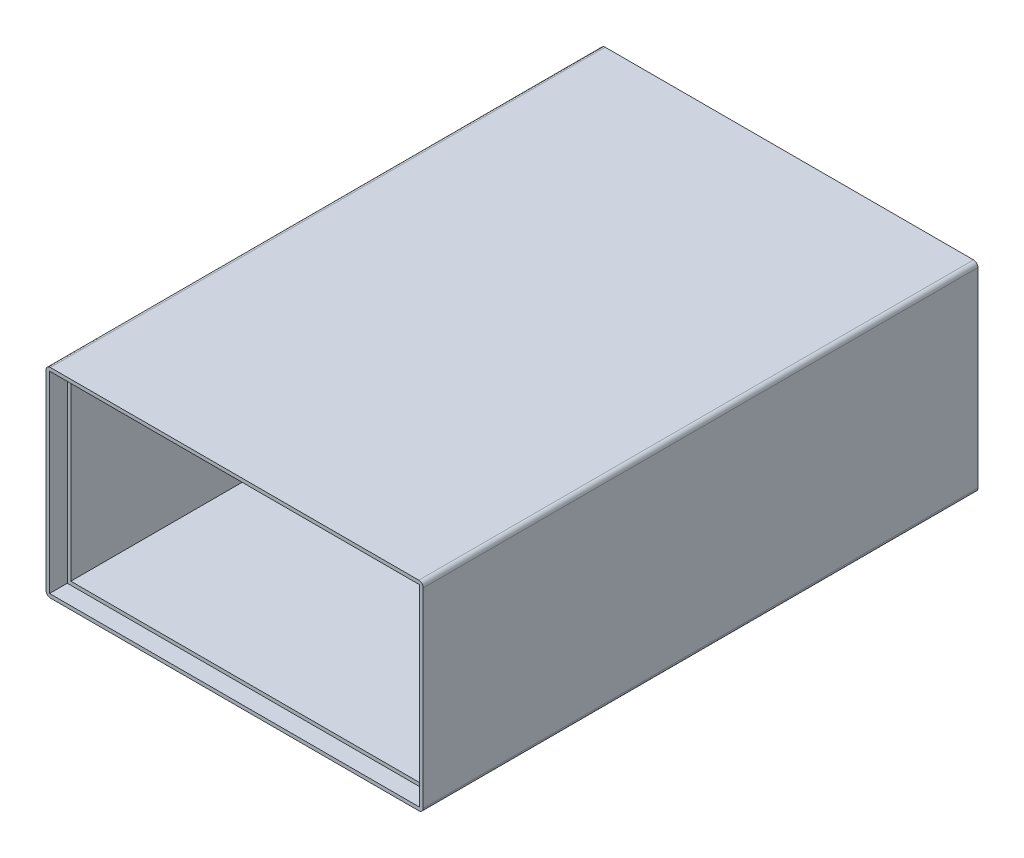
ISO-10303-21;
HEADER;
FILE_DESCRIPTION(('STEP AP214'),'2;1');
FILE_NAME('part.step','',(''),(''),'','','');
FILE_SCHEMA(('AUTOMOTIVE_DESIGN { 1 0 10303 214 1 1 1 1 }'));
ENDSEC;
DATA;
#1=APPLICATION_CONTEXT('core data for automotive mechanical design processes');
#2=APPLICATION_PROTOCOL_DEFINITION('international standard','automotive_design',2000,#1);
#3=PRODUCT_CONTEXT('',#1,'mechanical');
#4=PRODUCT('Part','Part','',(#3));
#5=PRODUCT_RELATED_PRODUCT_CATEGORY('part','',(#4));
#6=PRODUCT_DEFINITION_FORMATION('','',#4);
#7=PRODUCT_DEFINITION_CONTEXT('part definition',#1,'design');
#8=PRODUCT_DEFINITION('design','',#6,#7);
#9=PRODUCT_DEFINITION_SHAPE('','',#8);
#10=(LENGTH_UNIT() NAMED_UNIT(*) SI_UNIT(.MILLI.,.METRE.));
#11=(NAMED_UNIT(*) PLANE_ANGLE_UNIT() SI_UNIT($,.RADIAN.));
#12=(NAMED_UNIT(*) SI_UNIT($,.STERADIAN.) SOLID_ANGLE_UNIT());
#13=UNCERTAINTY_MEASURE_WITH_UNIT(LENGTH_MEASURE(1.E-05),#10,'distance_accuracy_value','');
#14=(GEOMETRIC_REPRESENTATION_CONTEXT(3) GLOBAL_UNCERTAINTY_ASSIGNED_CONTEXT((#13)) GLOBAL_UNIT_ASSIGNED_CONTEXT((#10,
#11,#12)) REPRESENTATION_CONTEXT('',''));
#15=CARTESIAN_POINT('',(0.,0.,0.));
#16=DIRECTION('',(0.,0.,1.));
#17=DIRECTION('',(1.,0.,0.));
#18=AXIS2_PLACEMENT_3D('',#15,#16,#17);
#19=CARTESIAN_POINT('',(0.,0.,125.));
#20=DIRECTION('',(1.,0.,0.));
#21=DIRECTION('',(0.,0.,-1.));
#22=AXIS2_PLACEMENT_3D('',#19,#20,#21);
#23=PLANE('',#22);
#24=DIRECTION('',(0.,-1.,0.));
#25=VECTOR('',#24,1.);
#26=CARTESIAN_POINT('',(0.,0.,125.));
#27=LINE('',#26,#25);
#28=CARTESIAN_POINT('',(0.,44.,125.));
#29=VERTEX_POINT('',#28);
#30=CARTESIAN_POINT('',(0.,1.,125.));
#31=VERTEX_POINT('',#30);
#32=EDGE_CURVE('E898',#29,#31,#27,.T.);
#33=ORIENTED_EDGE('',*,*,#32,.F.);
#34=DIRECTION('',(0.,0.,-1.));
#35=VECTOR('',#34,1.);
#36=CARTESIAN_POINT('',(0.,44.,125.));
#37=LINE('',#36,#35);
#38=CARTESIAN_POINT('',(0.,44.,0.));
#39=VERTEX_POINT('',#38);
#40=EDGE_CURVE('E922',#29,#39,#37,.T.);
#41=ORIENTED_EDGE('',*,*,#40,.T.);
#42=DIRECTION('',(0.,-1.,0.));
#43=VECTOR('',#42,1.);
#44=CARTESIAN_POINT('',(0.,0.,0.));
#45=LINE('',#44,#43);
#46=CARTESIAN_POINT('',(0.,1.,0.));
#47=VERTEX_POINT('',#46);
#48=EDGE_CURVE('E889',#39,#47,#45,.T.);
#49=ORIENTED_EDGE('',*,*,#48,.T.);
#50=DIRECTION('',(0.,0.,-1.));
#51=VECTOR('',#50,1.);
#52=CARTESIAN_POINT('',(0.,1.,125.));
#53=LINE('',#52,#51);
#54=EDGE_CURVE('E920',#47,#31,#53,.F.);
#55=ORIENTED_EDGE('',*,*,#54,.T.);
#56=EDGE_LOOP('',(#33,#41,#49,#55));
#57=FACE_BOUND('',#56,.T.);
#58=ADVANCED_FACE('F710',(#57),#23,.F.);
#59=CARTESIAN_POINT('',(0.,0.,125.));
#60=DIRECTION('',(0.,1.,0.));
#61=DIRECTION('',(0.,0.,1.));
#62=AXIS2_PLACEMENT_3D('',#59,#60,#61);
#63=PLANE('',#62);
#64=DIRECTION('',(1.,0.,0.));
#65=VECTOR('',#64,1.);
#66=CARTESIAN_POINT('',(0.,0.,0.));
#67=LINE('',#66,#65);
#68=CARTESIAN_POINT('',(1.,0.,0.));
#69=VERTEX_POINT('',#68);
#70=CARTESIAN_POINT('',(84.,0.,0.));
#71=VERTEX_POINT('',#70);
#72=EDGE_CURVE('E912',#69,#71,#67,.T.);
#73=ORIENTED_EDGE('',*,*,#72,.T.);
#74=DIRECTION('',(0.,0.,-1.));
#75=VECTOR('',#74,1.);
#76=CARTESIAN_POINT('',(84.,0.,125.));
#77=LINE('',#76,#75);
#78=CARTESIAN_POINT('',(84.,0.,125.));
#79=VERTEX_POINT('',#78);
#80=EDGE_CURVE('E12',#71,#79,#77,.F.);
#81=ORIENTED_EDGE('',*,*,#80,.T.);
#82=DIRECTION('',(1.,0.,0.));
#83=VECTOR('',#82,1.);
#84=CARTESIAN_POINT('',(0.,0.,125.));
#85=LINE('',#84,#83);
#86=CARTESIAN_POINT('',(1.,0.,125.));
#87=VERTEX_POINT('',#86);
#88=EDGE_CURVE('E901',#87,#79,#85,.T.);
#89=ORIENTED_EDGE('',*,*,#88,.F.);
#90=DIRECTION('',(0.,0.,-1.));
#91=VECTOR('',#90,1.);
#92=CARTESIAN_POINT('',(1.,0.,125.));
#93=LINE('',#92,#91);
#94=EDGE_CURVE('E718',#87,#69,#93,.T.);
#95=ORIENTED_EDGE('',*,*,#94,.T.);
#96=EDGE_LOOP('',(#73,#81,#89,#95));
#97=FACE_BOUND('',#96,.T.);
#98=ADVANCED_FACE('F953',(#97),#63,.F.);
#99=CARTESIAN_POINT('',(85.,0.,125.));
#100=DIRECTION('',(-1.,0.,0.));
#101=DIRECTION('',(0.,0.,1.));
#102=AXIS2_PLACEMENT_3D('',#99,#100,#101);
#103=PLANE('',#102);
#104=DIRECTION('',(0.,1.,0.));
#105=VECTOR('',#104,1.);
#106=CARTESIAN_POINT('',(85.,0.,0.));
#107=LINE('',#106,#105);
#108=CARTESIAN_POINT('',(85.,1.,0.));
#109=VERTEX_POINT('',#108);
#110=CARTESIAN_POINT('',(85.,44.,0.));
#111=VERTEX_POINT('',#110);
#112=EDGE_CURVE('E915',#109,#111,#107,.T.);
#113=ORIENTED_EDGE('',*,*,#112,.T.);
#114=DIRECTION('',(0.,0.,-1.));
#115=VECTOR('',#114,1.);
#116=CARTESIAN_POINT('',(85.,44.,125.));
#117=LINE('',#116,#115);
#118=CARTESIAN_POINT('',(85.,44.,125.));
#119=VERTEX_POINT('',#118);
#120=EDGE_CURVE('E725',#111,#119,#117,.F.);
#121=ORIENTED_EDGE('',*,*,#120,.T.);
#122=DIRECTION('',(0.,1.,0.));
#123=VECTOR('',#122,1.);
#124=CARTESIAN_POINT('',(85.,0.,125.));
#125=LINE('',#124,#123);
#126=CARTESIAN_POINT('',(85.,1.,125.));
#127=VERTEX_POINT('',#126);
#128=EDGE_CURVE('E904',#127,#119,#125,.T.);
#129=ORIENTED_EDGE('',*,*,#128,.F.);
#130=DIRECTION('',(0.,0.,-1.));
#131=VECTOR('',#130,1.);
#132=CARTESIAN_POINT('',(85.,1.,125.));
#133=LINE('',#132,#131);
#134=EDGE_CURVE('E945',#127,#109,#133,.T.);
#135=ORIENTED_EDGE('',*,*,#134,.T.);
#136=EDGE_LOOP('',(#113,#121,#129,#135));
#137=FACE_BOUND('',#136,.T.);
#138=ADVANCED_FACE('F964',(#137),#103,.F.);
#139=CARTESIAN_POINT('',(0.,45.,125.));
#140=DIRECTION('',(0.,-1.,0.));
#141=DIRECTION('',(0.,0.,-1.));
#142=AXIS2_PLACEMENT_3D('',#139,#140,#141);
#143=PLANE('',#142);
#144=DIRECTION('',(-1.,0.,0.));
#145=VECTOR('',#144,1.);
#146=CARTESIAN_POINT('',(0.,45.,0.));
#147=LINE('',#146,#145);
#148=CARTESIAN_POINT('',(84.,45.,0.));
#149=VERTEX_POINT('',#148);
#150=CARTESIAN_POINT('',(1.,45.,0.));
#151=VERTEX_POINT('',#150);
#152=EDGE_CURVE('E902',#149,#151,#147,.T.);
#153=ORIENTED_EDGE('',*,*,#152,.T.);
#154=DIRECTION('',(0.,0.,-1.));
#155=VECTOR('',#154,1.);
#156=CARTESIAN_POINT('',(1.,45.,125.));
#157=LINE('',#156,#155);
#158=CARTESIAN_POINT('',(1.,45.,125.));
#159=VERTEX_POINT('',#158);
#160=EDGE_CURVE('E936',#151,#159,#157,.F.);
#161=ORIENTED_EDGE('',*,*,#160,.T.);
#162=DIRECTION('',(-1.,0.,0.));
#163=VECTOR('',#162,1.);
#164=CARTESIAN_POINT('',(0.,45.,125.));
#165=LINE('',#164,#163);
#166=CARTESIAN_POINT('',(84.,45.,125.));
#167=VERTEX_POINT('',#166);
#168=EDGE_CURVE('E906',#167,#159,#165,.T.);
#169=ORIENTED_EDGE('',*,*,#168,.F.);
#170=DIRECTION('',(0.,0.,-1.));
#171=VECTOR('',#170,1.);
#172=CARTESIAN_POINT('',(84.,45.,125.));
#173=LINE('',#172,#171);
#174=EDGE_CURVE('E933',#167,#149,#173,.T.);
#175=ORIENTED_EDGE('',*,*,#174,.T.);
#176=EDGE_LOOP('',(#153,#161,#169,#175));
#177=FACE_BOUND('',#176,.T.);
#178=ADVANCED_FACE('F973',(#177),#143,.F.);
#179=CARTESIAN_POINT('',(0.,0.,125.));
#180=DIRECTION('',(0.,0.,-1.));
#181=DIRECTION('',(-1.,0.,0.));
#182=AXIS2_PLACEMENT_3D('',#179,#180,#181);
#183=PLANE('',#182);
#184=DIRECTION('',(-1.,0.,0.));
#185=VECTOR('',#184,1.);
#186=CARTESIAN_POINT('',(0.8,44.2,125.));
#187=LINE('',#186,#185);
#188=CARTESIAN_POINT('',(84.2,44.2,125.));
#189=VERTEX_POINT('',#188);
#190=CARTESIAN_POINT('',(0.8,44.2,125.));
#191=VERTEX_POINT('',#190);
#192=EDGE_CURVE('E858',#189,#191,#187,.T.);
#193=ORIENTED_EDGE('',*,*,#192,.F.);
#194=DIRECTION('',(0.,1.,0.));
#195=VECTOR('',#194,1.);
#196=CARTESIAN_POINT('',(84.2,44.2,125.));
#197=LINE('',#196,#195);
#198=CARTESIAN_POINT('',(84.2,0.800000000000002,125.));
#199=VERTEX_POINT('',#198);
#200=EDGE_CURVE('E831',#199,#189,#197,.T.);
#201=ORIENTED_EDGE('',*,*,#200,.F.);
#202=DIRECTION('',(1.,0.,0.));
#203=VECTOR('',#202,1.);
#204=CARTESIAN_POINT('',(0.8,0.800000000000006,125.));
#205=LINE('',#204,#203);
#206=CARTESIAN_POINT('',(0.8,0.800000000000006,125.));
#207=VERTEX_POINT('',#206);
#208=EDGE_CURVE('E849',#207,#199,#205,.T.);
#209=ORIENTED_EDGE('',*,*,#208,.F.);
#210=DIRECTION('',(0.,-1.,0.));
#211=VECTOR('',#210,1.);
#212=CARTESIAN_POINT('',(0.8,44.2,125.));
#213=LINE('',#212,#211);
#214=EDGE_CURVE('E852',#191,#207,#213,.T.);
#215=ORIENTED_EDGE('',*,*,#214,.F.);
#216=EDGE_LOOP('',(#193,#201,#209,#215));
#217=FACE_BOUND('',#216,.T.);
#218=ORIENTED_EDGE('',*,*,#168,.T.);
#219=CARTESIAN_POINT('',(1.,44.,125.));
#220=DIRECTION('',(0.,0.,-1.));
#221=DIRECTION('',(-1.,0.,0.));
#222=AXIS2_PLACEMENT_3D('',#219,#220,#221);
#223=CIRCLE('',#222,1.);
#224=EDGE_CURVE('E943',#159,#29,#223,.F.);
#225=ORIENTED_EDGE('',*,*,#224,.T.);
#226=ORIENTED_EDGE('',*,*,#32,.T.);
#227=CARTESIAN_POINT('',(1.,1.,125.));
#228=DIRECTION('',(0.,0.,-1.));
#229=DIRECTION('',(-1.,0.,0.));
#230=AXIS2_PLACEMENT_3D('',#227,#228,#229);
#231=CIRCLE('',#230,1.);
#232=EDGE_CURVE('E938',#31,#87,#231,.F.);
#233=ORIENTED_EDGE('',*,*,#232,.T.);
#234=ORIENTED_EDGE('',*,*,#88,.T.);
#235=CARTESIAN_POINT('',(84.,1.,125.));
#236=DIRECTION('',(0.,0.,-1.));
#237=DIRECTION('',(-1.,0.,0.));
#238=AXIS2_PLACEMENT_3D('',#235,#236,#237);
#239=CIRCLE('',#238,1.);
#240=EDGE_CURVE('E732',#79,#127,#239,.F.);
#241=ORIENTED_EDGE('',*,*,#240,.T.);
#242=ORIENTED_EDGE('',*,*,#128,.T.);
#243=CARTESIAN_POINT('',(84.,44.,125.));
#244=DIRECTION('',(0.,0.,-1.));
#245=DIRECTION('',(-1.,0.,0.));
#246=AXIS2_PLACEMENT_3D('',#243,#244,#245);
#247=CIRCLE('',#246,1.);
#248=EDGE_CURVE('E941',#119,#167,#247,.F.);
#249=ORIENTED_EDGE('',*,*,#248,.T.);
#250=EDGE_LOOP('',(#218,#225,#226,#233,#234,#241,#242,#249));
#251=FACE_BOUND('',#250,.T.);
#252=ADVANCED_FACE('F966',(#217,#251),#183,.F.);
#253=CARTESIAN_POINT('',(0.,0.,0.));
#254=DIRECTION('',(0.,0.,-1.));
#255=DIRECTION('',(-1.,0.,0.));
#256=AXIS2_PLACEMENT_3D('',#253,#254,#255);
#257=PLANE('',#256);
#258=ORIENTED_EDGE('',*,*,#48,.F.);
#259=CARTESIAN_POINT('',(1.,44.,0.));
#260=DIRECTION('',(0.,0.,-1.));
#261=DIRECTION('',(-1.,0.,0.));
#262=AXIS2_PLACEMENT_3D('',#259,#260,#261);
#263=CIRCLE('',#262,1.);
#264=EDGE_CURVE('E931',#39,#151,#263,.T.);
#265=ORIENTED_EDGE('',*,*,#264,.T.);
#266=ORIENTED_EDGE('',*,*,#152,.F.);
#267=CARTESIAN_POINT('',(84.,44.,0.));
#268=DIRECTION('',(0.,0.,-1.));
#269=DIRECTION('',(-1.,0.,0.));
#270=AXIS2_PLACEMENT_3D('',#267,#268,#269);
#271=CIRCLE('',#270,1.);
#272=EDGE_CURVE('E929',#149,#111,#271,.T.);
#273=ORIENTED_EDGE('',*,*,#272,.T.);
#274=ORIENTED_EDGE('',*,*,#112,.F.);
#275=CARTESIAN_POINT('',(84.,1.,0.));
#276=DIRECTION('',(0.,0.,-1.));
#277=DIRECTION('',(-1.,0.,0.));
#278=AXIS2_PLACEMENT_3D('',#275,#276,#277);
#279=CIRCLE('',#278,1.);
#280=EDGE_CURVE('E927',#109,#71,#279,.T.);
#281=ORIENTED_EDGE('',*,*,#280,.T.);
#282=ORIENTED_EDGE('',*,*,#72,.F.);
#283=CARTESIAN_POINT('',(1.,1.,0.));
#284=DIRECTION('',(0.,0.,-1.));
#285=DIRECTION('',(-1.,0.,0.));
#286=AXIS2_PLACEMENT_3D('',#283,#284,#285);
#287=CIRCLE('',#286,1.);
#288=EDGE_CURVE('E925',#69,#47,#287,.T.);
#289=ORIENTED_EDGE('',*,*,#288,.T.);
#290=EDGE_LOOP('',(#258,#265,#266,#273,#274,#281,#282,#289));
#291=FACE_BOUND('',#290,.T.);
#292=ADVANCED_FACE('F959',(#291),#257,.T.);
#293=CARTESIAN_POINT('',(0.,0.,121.));
#294=DIRECTION('',(0.,0.,1.));
#295=DIRECTION('',(1.,0.,0.));
#296=AXIS2_PLACEMENT_3D('',#293,#294,#295);
#297=PLANE('',#296);
#298=DIRECTION('',(0.,1.,0.));
#299=VECTOR('',#298,1.);
#300=CARTESIAN_POINT('',(84.2,44.2,121.));
#301=LINE('',#300,#299);
#302=CARTESIAN_POINT('',(84.2,0.800000000000002,121.));
#303=VERTEX_POINT('',#302);
#304=CARTESIAN_POINT('',(84.2,44.2,121.));
#305=VERTEX_POINT('',#304);
#306=EDGE_CURVE('E828',#303,#305,#301,.T.);
#307=ORIENTED_EDGE('',*,*,#306,.T.);
#308=DIRECTION('',(-1.,0.,0.));
#309=VECTOR('',#308,1.);
#310=CARTESIAN_POINT('',(0.8,44.2,121.));
#311=LINE('',#310,#309);
#312=CARTESIAN_POINT('',(0.8,44.2,121.));
#313=VERTEX_POINT('',#312);
#314=EDGE_CURVE('E839',#305,#313,#311,.T.);
#315=ORIENTED_EDGE('',*,*,#314,.T.);
#316=DIRECTION('',(0.,-1.,0.));
#317=VECTOR('',#316,1.);
#318=CARTESIAN_POINT('',(0.8,44.2,121.));
#319=LINE('',#318,#317);
#320=CARTESIAN_POINT('',(0.8,0.800000000000006,121.));
#321=VERTEX_POINT('',#320);
#322=EDGE_CURVE('E844',#313,#321,#319,.T.);
#323=ORIENTED_EDGE('',*,*,#322,.T.);
#324=DIRECTION('',(1.,0.,0.));
#325=VECTOR('',#324,1.);
#326=CARTESIAN_POINT('',(0.8,0.800000000000006,121.));
#327=LINE('',#326,#325);
#328=EDGE_CURVE('E836',#321,#303,#327,.T.);
#329=ORIENTED_EDGE('',*,*,#328,.T.);
#330=EDGE_LOOP('',(#307,#315,#323,#329));
#331=FACE_BOUND('',#330,.T.);
#332=DIRECTION('',(0.,-1.,0.));
#333=VECTOR('',#332,1.);
#334=CARTESIAN_POINT('',(83.4,43.4,121.));
#335=LINE('',#334,#333);
#336=CARTESIAN_POINT('',(83.4,43.4,121.));
#337=VERTEX_POINT('',#336);
#338=CARTESIAN_POINT('',(83.4,1.6,121.));
#339=VERTEX_POINT('',#338);
#340=EDGE_CURVE('E871',#337,#339,#335,.T.);
#341=ORIENTED_EDGE('',*,*,#340,.T.);
#342=DIRECTION('',(-1.,0.,0.));
#343=VECTOR('',#342,1.);
#344=CARTESIAN_POINT('',(1.59999999999998,1.6,121.));
#345=LINE('',#344,#343);
#346=CARTESIAN_POINT('',(1.59999999999998,1.6,121.));
#347=VERTEX_POINT('',#346);
#348=EDGE_CURVE('E869',#339,#347,#345,.T.);
#349=ORIENTED_EDGE('',*,*,#348,.T.);
#350=DIRECTION('',(0.,1.,0.));
#351=VECTOR('',#350,1.);
#352=CARTESIAN_POINT('',(1.59999999999998,43.4,121.));
#353=LINE('',#352,#351);
#354=CARTESIAN_POINT('',(1.59999999999998,43.4,121.));
#355=VERTEX_POINT('',#354);
#356=EDGE_CURVE('E864',#347,#355,#353,.T.);
#357=ORIENTED_EDGE('',*,*,#356,.T.);
#358=DIRECTION('',(1.,0.,0.));
#359=VECTOR('',#358,1.);
#360=CARTESIAN_POINT('',(1.59999999999998,43.4,121.));
#361=LINE('',#360,#359);
#362=EDGE_CURVE('E909',#355,#337,#361,.T.);
#363=ORIENTED_EDGE('',*,*,#362,.T.);
#364=EDGE_LOOP('',(#341,#349,#357,#363));
#365=FACE_BOUND('',#364,.T.);
#366=ADVANCED_FACE('F846',(#331,#365),#297,.T.);
#367=CARTESIAN_POINT('',(84.2,44.2,121.));
#368=DIRECTION('',(1.,0.,0.));
#369=DIRECTION('',(0.,0.,-1.));
#370=AXIS2_PLACEMENT_3D('',#367,#368,#369);
#371=PLANE('',#370);
#372=ORIENTED_EDGE('',*,*,#200,.T.);
#373=DIRECTION('',(0.,0.,1.));
#374=VECTOR('',#373,1.);
#375=CARTESIAN_POINT('',(84.2,44.2,121.));
#376=LINE('',#375,#374);
#377=EDGE_CURVE('E824',#305,#189,#376,.T.);
#378=ORIENTED_EDGE('',*,*,#377,.F.);
#379=ORIENTED_EDGE('',*,*,#306,.F.);
#380=DIRECTION('',(0.,0.,1.));
#381=VECTOR('',#380,1.);
#382=CARTESIAN_POINT('',(84.2,0.800000000000002,121.));
#383=LINE('',#382,#381);
#384=EDGE_CURVE('E862',#303,#199,#383,.T.);
#385=ORIENTED_EDGE('',*,*,#384,.T.);
#386=EDGE_LOOP('',(#372,#378,#379,#385));
#387=FACE_BOUND('',#386,.T.);
#388=ADVANCED_FACE('F826',(#387),#371,.F.);
#389=CARTESIAN_POINT('',(0.8,0.800000000000006,121.));
#390=DIRECTION('',(0.,-1.,0.));
#391=DIRECTION('',(1.,0.,0.));
#392=AXIS2_PLACEMENT_3D('',#389,#390,#391);
#393=PLANE('',#392);
#394=ORIENTED_EDGE('',*,*,#208,.T.);
#395=ORIENTED_EDGE('',*,*,#384,.F.);
#396=ORIENTED_EDGE('',*,*,#328,.F.);
#397=DIRECTION('',(0.,0.,1.));
#398=VECTOR('',#397,1.);
#399=CARTESIAN_POINT('',(0.8,0.800000000000006,121.));
#400=LINE('',#399,#398);
#401=EDGE_CURVE('E865',#321,#207,#400,.T.);
#402=ORIENTED_EDGE('',*,*,#401,.T.);
#403=EDGE_LOOP('',(#394,#395,#396,#402));
#404=FACE_BOUND('',#403,.T.);
#405=ADVANCED_FACE('F1038',(#404),#393,.F.);
#406=CARTESIAN_POINT('',(0.8,44.2,121.));
#407=DIRECTION('',(-1.,0.,0.));
#408=DIRECTION('',(0.,0.,1.));
#409=AXIS2_PLACEMENT_3D('',#406,#407,#408);
#410=PLANE('',#409);
#411=ORIENTED_EDGE('',*,*,#214,.T.);
#412=ORIENTED_EDGE('',*,*,#401,.F.);
#413=ORIENTED_EDGE('',*,*,#322,.F.);
#414=DIRECTION('',(0.,0.,1.));
#415=VECTOR('',#414,1.);
#416=CARTESIAN_POINT('',(0.8,44.2,121.));
#417=LINE('',#416,#415);
#418=EDGE_CURVE('E835',#313,#191,#417,.T.);
#419=ORIENTED_EDGE('',*,*,#418,.T.);
#420=EDGE_LOOP('',(#411,#412,#413,#419));
#421=FACE_BOUND('',#420,.T.);
#422=ADVANCED_FACE('F1029',(#421),#410,.F.);
#423=CARTESIAN_POINT('',(0.8,44.2,121.));
#424=DIRECTION('',(0.,1.,0.));
#425=DIRECTION('',(0.,0.,1.));
#426=AXIS2_PLACEMENT_3D('',#423,#424,#425);
#427=PLANE('',#426);
#428=ORIENTED_EDGE('',*,*,#192,.T.);
#429=ORIENTED_EDGE('',*,*,#418,.F.);
#430=ORIENTED_EDGE('',*,*,#314,.F.);
#431=ORIENTED_EDGE('',*,*,#377,.T.);
#432=EDGE_LOOP('',(#428,#429,#430,#431));
#433=FACE_BOUND('',#432,.T.);
#434=ADVANCED_FACE('F840',(#433),#427,.F.);
#435=CARTESIAN_POINT('',(0.,0.,1.59999999999999));
#436=DIRECTION('',(0.,0.,1.));
#437=DIRECTION('',(1.,0.,0.));
#438=AXIS2_PLACEMENT_3D('',#435,#436,#437);
#439=PLANE('',#438);
#440=DIRECTION('',(0.,1.,0.));
#441=VECTOR('',#440,1.);
#442=CARTESIAN_POINT('',(83.4,43.4,1.59999999999999));
#443=LINE('',#442,#441);
#444=CARTESIAN_POINT('',(83.4,1.6,1.59999999999999));
#445=VERTEX_POINT('',#444);
#446=CARTESIAN_POINT('',(83.4,43.4,1.59999999999999));
#447=VERTEX_POINT('',#446);
#448=EDGE_CURVE('E873',#445,#447,#443,.T.);
#449=ORIENTED_EDGE('',*,*,#448,.T.);
#450=DIRECTION('',(-1.,0.,0.));
#451=VECTOR('',#450,1.);
#452=CARTESIAN_POINT('',(1.59999999999998,43.4,1.59999999999999));
#453=LINE('',#452,#451);
#454=CARTESIAN_POINT('',(1.59999999999998,43.4,1.59999999999999));
#455=VERTEX_POINT('',#454);
#456=EDGE_CURVE('E876',#447,#455,#453,.T.);
#457=ORIENTED_EDGE('',*,*,#456,.T.);
#458=DIRECTION('',(0.,-1.,0.));
#459=VECTOR('',#458,1.);
#460=CARTESIAN_POINT('',(1.59999999999998,43.4,1.59999999999999));
#461=LINE('',#460,#459);
#462=CARTESIAN_POINT('',(1.59999999999998,1.6,1.59999999999999));
#463=VERTEX_POINT('',#462);
#464=EDGE_CURVE('E879',#455,#463,#461,.T.);
#465=ORIENTED_EDGE('',*,*,#464,.T.);
#466=DIRECTION('',(1.,0.,0.));
#467=VECTOR('',#466,1.);
#468=CARTESIAN_POINT('',(1.59999999999998,1.6,1.59999999999999));
#469=LINE('',#468,#467);
#470=EDGE_CURVE('E882',#463,#445,#469,.T.);
#471=ORIENTED_EDGE('',*,*,#470,.T.);
#472=EDGE_LOOP('',(#449,#457,#465,#471));
#473=FACE_BOUND('',#472,.T.);
#474=ADVANCED_FACE('F1028',(#473),#439,.T.);
#475=CARTESIAN_POINT('',(1.59999999999998,43.4,1.59999999999999));
#476=DIRECTION('',(0.,1.,0.));
#477=DIRECTION('',(0.,0.,1.));
#478=AXIS2_PLACEMENT_3D('',#475,#476,#477);
#479=PLANE('',#478);
#480=ORIENTED_EDGE('',*,*,#362,.F.);
#481=DIRECTION('',(0.,0.,1.));
#482=VECTOR('',#481,1.);
#483=CARTESIAN_POINT('',(1.59999999999998,43.4,1.59999999999999));
#484=LINE('',#483,#482);
#485=EDGE_CURVE('E893',#455,#355,#484,.T.);
#486=ORIENTED_EDGE('',*,*,#485,.F.);
#487=ORIENTED_EDGE('',*,*,#456,.F.);
#488=DIRECTION('',(0.,0.,1.));
#489=VECTOR('',#488,1.);
#490=CARTESIAN_POINT('',(83.4,43.4,1.59999999999999));
#491=LINE('',#490,#489);
#492=EDGE_CURVE('E885',#447,#337,#491,.T.);
#493=ORIENTED_EDGE('',*,*,#492,.T.);
#494=EDGE_LOOP('',(#480,#486,#487,#493));
#495=FACE_BOUND('',#494,.T.);
#496=ADVANCED_FACE('F1087',(#495),#479,.F.);
#497=CARTESIAN_POINT('',(1.59999999999998,43.4,1.59999999999999));
#498=DIRECTION('',(-1.,0.,0.));
#499=DIRECTION('',(0.,0.,1.));
#500=AXIS2_PLACEMENT_3D('',#497,#498,#499);
#501=PLANE('',#500);
#502=ORIENTED_EDGE('',*,*,#356,.F.);
#503=DIRECTION('',(0.,0.,1.));
#504=VECTOR('',#503,1.);
#505=CARTESIAN_POINT('',(1.59999999999998,1.6,1.59999999999999));
#506=LINE('',#505,#504);
#507=EDGE_CURVE('E890',#463,#347,#506,.T.);
#508=ORIENTED_EDGE('',*,*,#507,.F.);
#509=ORIENTED_EDGE('',*,*,#464,.F.);
#510=ORIENTED_EDGE('',*,*,#485,.T.);
#511=EDGE_LOOP('',(#502,#508,#509,#510));
#512=FACE_BOUND('',#511,.T.);
#513=ADVANCED_FACE('F1078',(#512),#501,.F.);
#514=CARTESIAN_POINT('',(1.59999999999998,1.6,1.59999999999999));
#515=DIRECTION('',(0.,-1.,0.));
#516=DIRECTION('',(0.,0.,-1.));
#517=AXIS2_PLACEMENT_3D('',#514,#515,#516);
#518=PLANE('',#517);
#519=ORIENTED_EDGE('',*,*,#348,.F.);
#520=DIRECTION('',(0.,0.,1.));
#521=VECTOR('',#520,1.);
#522=CARTESIAN_POINT('',(83.4,1.6,1.59999999999999));
#523=LINE('',#522,#521);
#524=EDGE_CURVE('E886',#445,#339,#523,.T.);
#525=ORIENTED_EDGE('',*,*,#524,.F.);
#526=ORIENTED_EDGE('',*,*,#470,.F.);
#527=ORIENTED_EDGE('',*,*,#507,.T.);
#528=EDGE_LOOP('',(#519,#525,#526,#527));
#529=FACE_BOUND('',#528,.T.);
#530=ADVANCED_FACE('F1069',(#529),#518,.F.);
#531=CARTESIAN_POINT('',(83.4,43.4,1.59999999999999));
#532=DIRECTION('',(1.,0.,0.));
#533=DIRECTION('',(0.,0.,-1.));
#534=AXIS2_PLACEMENT_3D('',#531,#532,#533);
#535=PLANE('',#534);
#536=ORIENTED_EDGE('',*,*,#340,.F.);
#537=ORIENTED_EDGE('',*,*,#492,.F.);
#538=ORIENTED_EDGE('',*,*,#448,.F.);
#539=ORIENTED_EDGE('',*,*,#524,.T.);
#540=EDGE_LOOP('',(#536,#537,#538,#539));
#541=FACE_BOUND('',#540,.T.);
#542=ADVANCED_FACE('F996',(#541),#535,.F.);
#543=CARTESIAN_POINT('',(1.,44.,125.));
#544=DIRECTION('',(0.,0.,-1.));
#545=DIRECTION('',(-1.,0.,0.));
#546=AXIS2_PLACEMENT_3D('',#543,#544,#545);
#547=CYLINDRICAL_SURFACE('',#546,1.);
#548=ORIENTED_EDGE('',*,*,#224,.F.);
#549=ORIENTED_EDGE('',*,*,#160,.F.);
#550=ORIENTED_EDGE('',*,*,#264,.F.);
#551=ORIENTED_EDGE('',*,*,#40,.F.);
#552=EDGE_LOOP('',(#548,#549,#550,#551));
#553=FACE_BOUND('',#552,.T.);
#554=ADVANCED_FACE('F978',(#553),#547,.T.);
#555=CARTESIAN_POINT('',(84.,44.,125.));
#556=DIRECTION('',(0.,0.,-1.));
#557=DIRECTION('',(-1.,0.,0.));
#558=AXIS2_PLACEMENT_3D('',#555,#556,#557);
#559=CYLINDRICAL_SURFACE('',#558,1.);
#560=ORIENTED_EDGE('',*,*,#248,.F.);
#561=ORIENTED_EDGE('',*,*,#120,.F.);
#562=ORIENTED_EDGE('',*,*,#272,.F.);
#563=ORIENTED_EDGE('',*,*,#174,.F.);
#564=EDGE_LOOP('',(#560,#561,#562,#563));
#565=FACE_BOUND('',#564,.T.);
#566=ADVANCED_FACE('F970',(#565),#559,.T.);
#567=CARTESIAN_POINT('',(84.,1.,125.));
#568=DIRECTION('',(0.,0.,-1.));
#569=DIRECTION('',(-1.,0.,0.));
#570=AXIS2_PLACEMENT_3D('',#567,#568,#569);
#571=CYLINDRICAL_SURFACE('',#570,1.);
#572=ORIENTED_EDGE('',*,*,#240,.F.);
#573=ORIENTED_EDGE('',*,*,#80,.F.);
#574=ORIENTED_EDGE('',*,*,#280,.F.);
#575=ORIENTED_EDGE('',*,*,#134,.F.);
#576=EDGE_LOOP('',(#572,#573,#574,#575));
#577=FACE_BOUND('',#576,.T.);
#578=ADVANCED_FACE('F963',(#577),#571,.T.);
#579=CARTESIAN_POINT('',(1.,1.,125.));
#580=DIRECTION('',(0.,0.,-1.));
#581=DIRECTION('',(-1.,0.,0.));
#582=AXIS2_PLACEMENT_3D('',#579,#580,#581);
#583=CYLINDRICAL_SURFACE('',#582,1.);
#584=ORIENTED_EDGE('',*,*,#232,.F.);
#585=ORIENTED_EDGE('',*,*,#54,.F.);
#586=ORIENTED_EDGE('',*,*,#288,.F.);
#587=ORIENTED_EDGE('',*,*,#94,.F.);
#588=EDGE_LOOP('',(#584,#585,#586,#587));
#589=FACE_BOUND('',#588,.T.);
#590=ADVANCED_FACE('F712',(#589),#583,.T.);
#591=CLOSED_SHELL('',(#58,#98,#138,#178,#252,#292,#366,#388,#405,#422,#434,#474,#496,#513,#530,
#542,#554,#566,#578,#590));
#592=MANIFOLD_SOLID_BREP('B2',#591);
#593=ADVANCED_BREP_SHAPE_REPRESENTATION('',(#18,#592),#14);
#594=SHAPE_DEFINITION_REPRESENTATION(#9,#593);
ENDSEC;
END-ISO-10303-21;
